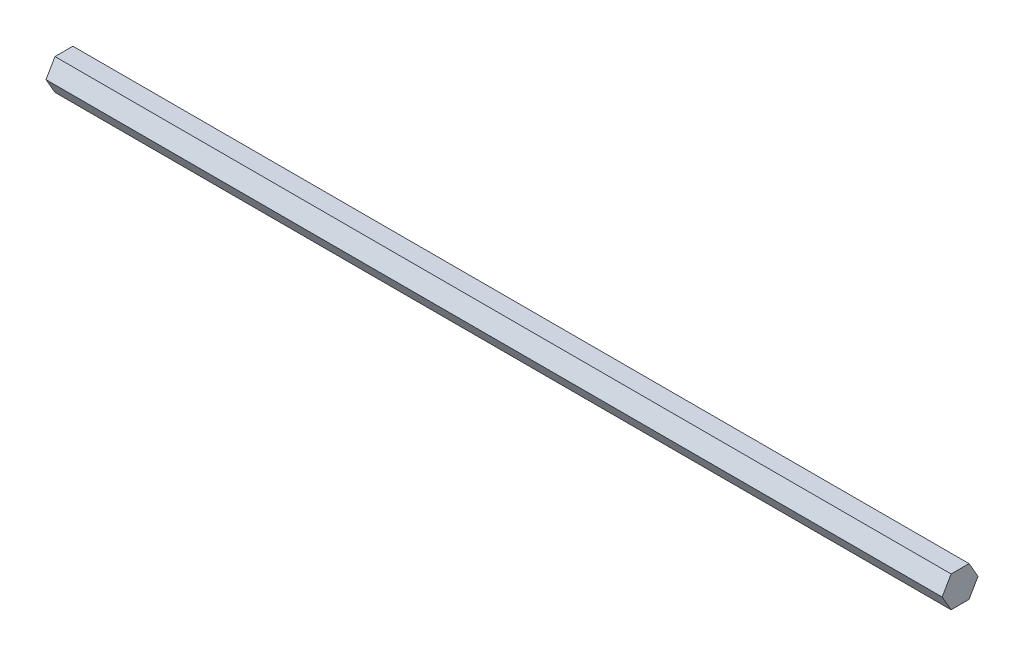
ISO-10303-21;
HEADER;
FILE_DESCRIPTION(('STEP AP214'),'2;1');
FILE_NAME('part.step','',(''),(''),'','','');
FILE_SCHEMA(('AUTOMOTIVE_DESIGN { 1 0 10303 214 1 1 1 1 }'));
ENDSEC;
DATA;
#1=APPLICATION_CONTEXT('core data for automotive mechanical design processes');
#2=APPLICATION_PROTOCOL_DEFINITION('international standard','automotive_design',2000,#1);
#3=PRODUCT_CONTEXT('',#1,'mechanical');
#4=PRODUCT('Part','Part','',(#3));
#5=PRODUCT_RELATED_PRODUCT_CATEGORY('part','',(#4));
#6=PRODUCT_DEFINITION_FORMATION('','',#4);
#7=PRODUCT_DEFINITION_CONTEXT('part definition',#1,'design');
#8=PRODUCT_DEFINITION('design','',#6,#7);
#9=PRODUCT_DEFINITION_SHAPE('','',#8);
#10=(LENGTH_UNIT() NAMED_UNIT(*) SI_UNIT(.MILLI.,.METRE.));
#11=(NAMED_UNIT(*) PLANE_ANGLE_UNIT() SI_UNIT($,.RADIAN.));
#12=(NAMED_UNIT(*) SI_UNIT($,.STERADIAN.) SOLID_ANGLE_UNIT());
#13=UNCERTAINTY_MEASURE_WITH_UNIT(LENGTH_MEASURE(1.E-05),#10,'distance_accuracy_value','');
#14=(GEOMETRIC_REPRESENTATION_CONTEXT(3) GLOBAL_UNCERTAINTY_ASSIGNED_CONTEXT((#13)) GLOBAL_UNIT_ASSIGNED_CONTEXT((#10,
#11,#12)) REPRESENTATION_CONTEXT('',''));
#15=CARTESIAN_POINT('',(0.,0.,0.));
#16=DIRECTION('',(0.,0.,1.));
#17=DIRECTION('',(1.,0.,0.));
#18=AXIS2_PLACEMENT_3D('',#15,#16,#17);
#19=CARTESIAN_POINT('',(635.,10.9992112572992,-6.3488071097886));
#20=DIRECTION('',(0.,-0.999999994118677,-0.000108455735859787));
#21=DIRECTION('',(0.,0.000108455735859787,-0.999999994118677));
#22=AXIS2_PLACEMENT_3D('',#19,#20,#21);
#23=PLANE('',#22);
#24=DIRECTION('',(0.,-0.000108455735859787,0.999999994118677));
#25=VECTOR('',#24,1.);
#26=CARTESIAN_POINT('',(0.,10.9992112572992,-6.3488071097886));
#27=LINE('',#26,#25);
#28=CARTESIAN_POINT('',(0.,10.9992112572992,-6.3488071097886));
#29=VERTEX_POINT('',#28);
#30=CARTESIAN_POINT('',(0.,10.9978338694538,6.3511928155186));
#31=VERTEX_POINT('',#30);
#32=EDGE_CURVE('E117',#29,#31,#27,.T.);
#33=ORIENTED_EDGE('',*,*,#32,.T.);
#34=DIRECTION('',(-1.,0.,0.));
#35=VECTOR('',#34,1.);
#36=CARTESIAN_POINT('',(635.,10.9978338694538,6.3511928155186));
#37=LINE('',#36,#35);
#38=CARTESIAN_POINT('',(635.,10.9978338694538,6.3511928155186));
#39=VERTEX_POINT('',#38);
#40=EDGE_CURVE('E11',#39,#31,#37,.T.);
#41=ORIENTED_EDGE('',*,*,#40,.F.);
#42=DIRECTION('',(0.,-0.000108455735859787,0.999999994118677));
#43=VECTOR('',#42,1.);
#44=CARTESIAN_POINT('',(635.,10.9992112572992,-6.3488071097886));
#45=LINE('',#44,#43);
#46=CARTESIAN_POINT('',(635.,10.9992112572992,-6.3488071097886));
#47=VERTEX_POINT('',#46);
#48=EDGE_CURVE('E127',#47,#39,#45,.T.);
#49=ORIENTED_EDGE('',*,*,#48,.F.);
#50=DIRECTION('',(-1.,0.,0.));
#51=VECTOR('',#50,1.);
#52=CARTESIAN_POINT('',(635.,10.9992112572992,-6.3488071097886));
#53=LINE('',#52,#51);
#54=EDGE_CURVE('E113',#47,#29,#53,.T.);
#55=ORIENTED_EDGE('',*,*,#54,.T.);
#56=EDGE_LOOP('',(#33,#41,#49,#55));
#57=FACE_BOUND('',#56,.T.);
#58=ADVANCED_FACE('F33',(#57),#23,.F.);
#59=CARTESIAN_POINT('',(635.,10.9978338694538,6.3511928155186));
#60=DIRECTION('',(0.,-0.499906071636897,-0.866079626558993));
#61=DIRECTION('',(0.,0.866079626558994,-0.499906071636897));
#62=AXIS2_PLACEMENT_3D('',#59,#60,#61);
#63=PLANE('',#62);
#64=DIRECTION('',(0.,-0.866079626558993,0.499906071636897));
#65=VECTOR('',#64,1.);
#66=CARTESIAN_POINT('',(0.,10.9978338694538,6.3511928155186));
#67=LINE('',#66,#65);
#68=CARTESIAN_POINT('',(0.,-0.00137738784541745,12.6999999253072));
#69=VERTEX_POINT('',#68);
#70=EDGE_CURVE('E120',#31,#69,#67,.T.);
#71=ORIENTED_EDGE('',*,*,#70,.T.);
#72=DIRECTION('',(-1.,0.,0.));
#73=VECTOR('',#72,1.);
#74=CARTESIAN_POINT('',(635.,-0.00137738784541745,12.6999999253072));
#75=LINE('',#74,#73);
#76=CARTESIAN_POINT('',(635.,-0.00137738784541745,12.6999999253072));
#77=VERTEX_POINT('',#76);
#78=EDGE_CURVE('E41',#77,#69,#75,.T.);
#79=ORIENTED_EDGE('',*,*,#78,.F.);
#80=DIRECTION('',(0.,-0.866079626558993,0.499906071636897));
#81=VECTOR('',#80,1.);
#82=CARTESIAN_POINT('',(635.,10.9978338694538,6.3511928155186));
#83=LINE('',#82,#81);
#84=EDGE_CURVE('E86',#39,#77,#83,.T.);
#85=ORIENTED_EDGE('',*,*,#84,.F.);
#86=ORIENTED_EDGE('',*,*,#40,.T.);
#87=EDGE_LOOP('',(#71,#79,#85,#86));
#88=FACE_BOUND('',#87,.T.);
#89=ADVANCED_FACE('F151',(#88),#63,.F.);
#90=CARTESIAN_POINT('',(635.,-0.00137738784541745,12.6999999253072));
#91=DIRECTION('',(0.,0.500093922481779,-0.865971170823133));
#92=DIRECTION('',(0.,0.865971170823133,0.500093922481779));
#93=AXIS2_PLACEMENT_3D('',#90,#91,#92);
#94=PLANE('',#93);
#95=DIRECTION('',(0.,-0.865971170823133,-0.500093922481779));
#96=VECTOR('',#95,1.);
#97=CARTESIAN_POINT('',(0.,-0.00137738784541745,12.6999999253072));
#98=LINE('',#97,#96);
#99=CARTESIAN_POINT('',(0.,-10.9992112572992,6.34880710978859));
#100=VERTEX_POINT('',#99);
#101=EDGE_CURVE('E122',#69,#100,#98,.T.);
#102=ORIENTED_EDGE('',*,*,#101,.T.);
#103=DIRECTION('',(-1.,0.,0.));
#104=VECTOR('',#103,1.);
#105=CARTESIAN_POINT('',(635.,-10.9992112572992,6.34880710978859));
#106=LINE('',#105,#104);
#107=CARTESIAN_POINT('',(635.,-10.9992112572992,6.34880710978859));
#108=VERTEX_POINT('',#107);
#109=EDGE_CURVE('E108',#108,#100,#106,.T.);
#110=ORIENTED_EDGE('',*,*,#109,.F.);
#111=DIRECTION('',(0.,-0.865971170823133,-0.500093922481779));
#112=VECTOR('',#111,1.);
#113=CARTESIAN_POINT('',(635.,-0.00137738784541745,12.6999999253072));
#114=LINE('',#113,#112);
#115=EDGE_CURVE('E99',#77,#108,#114,.T.);
#116=ORIENTED_EDGE('',*,*,#115,.F.);
#117=ORIENTED_EDGE('',*,*,#78,.T.);
#118=EDGE_LOOP('',(#102,#110,#116,#117));
#119=FACE_BOUND('',#118,.T.);
#120=ADVANCED_FACE('F133',(#119),#94,.F.);
#121=CARTESIAN_POINT('',(635.,-10.9992112572992,6.34880710978859));
#122=DIRECTION('',(0.,0.999999994118677,0.000108455735860197));
#123=DIRECTION('',(0.,-0.000108455735860197,0.999999994118677));
#124=AXIS2_PLACEMENT_3D('',#121,#122,#123);
#125=PLANE('',#124);
#126=DIRECTION('',(0.,0.000108455735860197,-0.999999994118677));
#127=VECTOR('',#126,1.);
#128=CARTESIAN_POINT('',(0.,-10.9992112572992,6.34880710978859));
#129=LINE('',#128,#127);
#130=CARTESIAN_POINT('',(0.,-10.9978338694538,-6.3511928155186));
#131=VERTEX_POINT('',#130);
#132=EDGE_CURVE('E107',#100,#131,#129,.T.);
#133=ORIENTED_EDGE('',*,*,#132,.T.);
#134=DIRECTION('',(-1.,0.,0.));
#135=VECTOR('',#134,1.);
#136=CARTESIAN_POINT('',(635.,-10.9978338694538,-6.3511928155186));
#137=LINE('',#136,#135);
#138=CARTESIAN_POINT('',(635.,-10.9978338694538,-6.3511928155186));
#139=VERTEX_POINT('',#138);
#140=EDGE_CURVE('E104',#139,#131,#137,.T.);
#141=ORIENTED_EDGE('',*,*,#140,.F.);
#142=DIRECTION('',(0.,0.000108455735860197,-0.999999994118677));
#143=VECTOR('',#142,1.);
#144=CARTESIAN_POINT('',(635.,-10.9992112572992,6.34880710978859));
#145=LINE('',#144,#143);
#146=EDGE_CURVE('E93',#108,#139,#145,.T.);
#147=ORIENTED_EDGE('',*,*,#146,.F.);
#148=ORIENTED_EDGE('',*,*,#109,.T.);
#149=EDGE_LOOP('',(#133,#141,#147,#148));
#150=FACE_BOUND('',#149,.T.);
#151=ADVANCED_FACE('F105',(#150),#125,.F.);
#152=CARTESIAN_POINT('',(635.,-10.9978338694538,-6.3511928155186));
#153=DIRECTION('',(0.,0.499906071636897,0.866079626558993));
#154=DIRECTION('',(0.,-0.866079626558993,0.499906071636898));
#155=AXIS2_PLACEMENT_3D('',#152,#153,#154);
#156=PLANE('',#155);
#157=DIRECTION('',(0.,0.866079626558993,-0.499906071636897));
#158=VECTOR('',#157,1.);
#159=CARTESIAN_POINT('',(0.,-10.9978338694538,-6.3511928155186));
#160=LINE('',#159,#158);
#161=CARTESIAN_POINT('',(0.,0.00137738784542415,-12.6999999253072));
#162=VERTEX_POINT('',#161);
#163=EDGE_CURVE('E72',#131,#162,#160,.T.);
#164=ORIENTED_EDGE('',*,*,#163,.T.);
#165=DIRECTION('',(-1.,0.,0.));
#166=VECTOR('',#165,1.);
#167=CARTESIAN_POINT('',(635.,0.00137738784542415,-12.6999999253072));
#168=LINE('',#167,#166);
#169=CARTESIAN_POINT('',(635.,0.00137738784542415,-12.6999999253072));
#170=VERTEX_POINT('',#169);
#171=EDGE_CURVE('E109',#170,#162,#168,.T.);
#172=ORIENTED_EDGE('',*,*,#171,.F.);
#173=DIRECTION('',(0.,0.866079626558993,-0.499906071636897));
#174=VECTOR('',#173,1.);
#175=CARTESIAN_POINT('',(635.,-10.9978338694538,-6.3511928155186));
#176=LINE('',#175,#174);
#177=EDGE_CURVE('E97',#139,#170,#176,.T.);
#178=ORIENTED_EDGE('',*,*,#177,.F.);
#179=ORIENTED_EDGE('',*,*,#140,.T.);
#180=EDGE_LOOP('',(#164,#172,#178,#179));
#181=FACE_BOUND('',#180,.T.);
#182=ADVANCED_FACE('F111',(#181),#156,.F.);
#183=CARTESIAN_POINT('',(635.,0.00137738784542415,-12.6999999253072));
#184=DIRECTION('',(0.,-0.500093922481779,0.865971170823133));
#185=DIRECTION('',(0.,-0.865971170823133,-0.500093922481779));
#186=AXIS2_PLACEMENT_3D('',#183,#184,#185);
#187=PLANE('',#186);
#188=DIRECTION('',(0.,0.865971170823133,0.500093922481779));
#189=VECTOR('',#188,1.);
#190=CARTESIAN_POINT('',(0.,0.00137738784542415,-12.6999999253072));
#191=LINE('',#190,#189);
#192=EDGE_CURVE('E78',#162,#29,#191,.T.);
#193=ORIENTED_EDGE('',*,*,#192,.T.);
#194=ORIENTED_EDGE('',*,*,#54,.F.);
#195=DIRECTION('',(0.,0.865971170823133,0.500093922481779));
#196=VECTOR('',#195,1.);
#197=CARTESIAN_POINT('',(635.,0.00137738784542415,-12.6999999253072));
#198=LINE('',#197,#196);
#199=EDGE_CURVE('E49',#170,#47,#198,.T.);
#200=ORIENTED_EDGE('',*,*,#199,.F.);
#201=ORIENTED_EDGE('',*,*,#171,.T.);
#202=EDGE_LOOP('',(#193,#194,#200,#201));
#203=FACE_BOUND('',#202,.T.);
#204=ADVANCED_FACE('F140',(#203),#187,.F.);
#205=CARTESIAN_POINT('',(635.,0.,0.));
#206=DIRECTION('',(1.,0.,0.));
#207=DIRECTION('',(0.,0.,-1.));
#208=AXIS2_PLACEMENT_3D('',#205,#206,#207);
#209=PLANE('',#208);
#210=ORIENTED_EDGE('',*,*,#48,.T.);
#211=ORIENTED_EDGE('',*,*,#84,.T.);
#212=ORIENTED_EDGE('',*,*,#115,.T.);
#213=ORIENTED_EDGE('',*,*,#146,.T.);
#214=ORIENTED_EDGE('',*,*,#177,.T.);
#215=ORIENTED_EDGE('',*,*,#199,.T.);
#216=EDGE_LOOP('',(#210,#211,#212,#213,#214,#215));
#217=FACE_BOUND('',#216,.T.);
#218=ADVANCED_FACE('F95',(#217),#209,.T.);
#219=CARTESIAN_POINT('',(0.,0.,0.));
#220=DIRECTION('',(1.,0.,0.));
#221=DIRECTION('',(0.,0.,-1.));
#222=AXIS2_PLACEMENT_3D('',#219,#220,#221);
#223=PLANE('',#222);
#224=ORIENTED_EDGE('',*,*,#32,.F.);
#225=ORIENTED_EDGE('',*,*,#192,.F.);
#226=ORIENTED_EDGE('',*,*,#163,.F.);
#227=ORIENTED_EDGE('',*,*,#132,.F.);
#228=ORIENTED_EDGE('',*,*,#101,.F.);
#229=ORIENTED_EDGE('',*,*,#70,.F.);
#230=EDGE_LOOP('',(#224,#225,#226,#227,#228,#229));
#231=FACE_BOUND('',#230,.T.);
#232=ADVANCED_FACE('F136',(#231),#223,.F.);
#233=CLOSED_SHELL('',(#58,#89,#120,#151,#182,#204,#218,#232));
#234=MANIFOLD_SOLID_BREP('B2',#233);
#235=ADVANCED_BREP_SHAPE_REPRESENTATION('',(#18,#234),#14);
#236=SHAPE_DEFINITION_REPRESENTATION(#9,#235);
ENDSEC;
END-ISO-10303-21;
